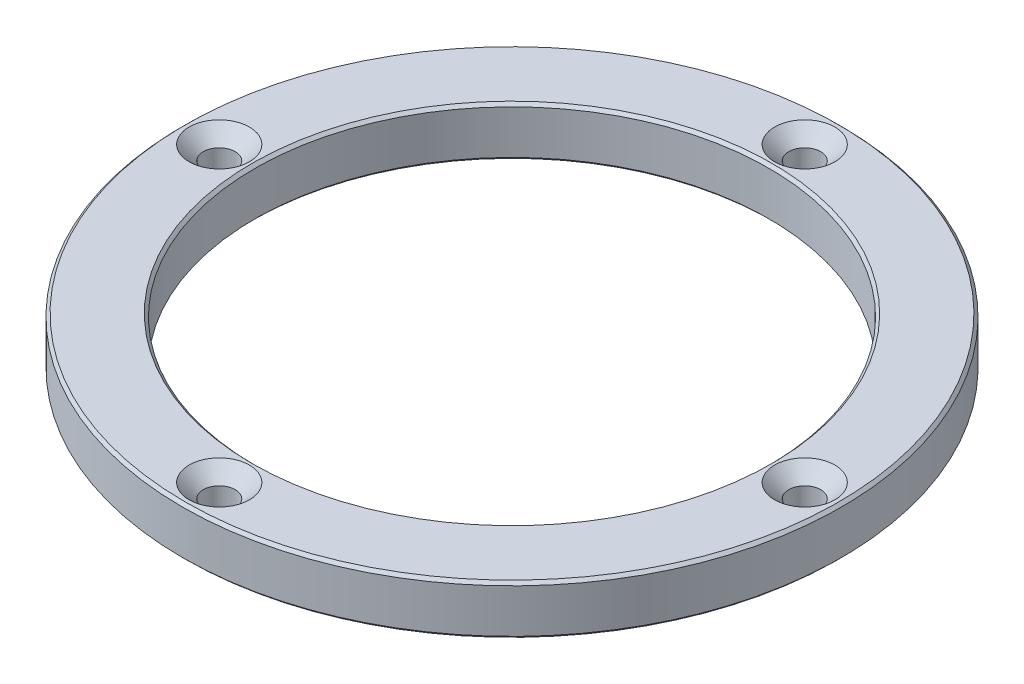
ISO-10303-21;
HEADER;
FILE_DESCRIPTION(('STEP AP214'),'2;1');
FILE_NAME('part.step','',(''),(''),'','','');
FILE_SCHEMA(('AUTOMOTIVE_DESIGN { 1 0 10303 214 1 1 1 1 }'));
ENDSEC;
DATA;
#1=APPLICATION_CONTEXT('core data for automotive mechanical design processes');
#2=APPLICATION_PROTOCOL_DEFINITION('international standard','automotive_design',2000,#1);
#3=PRODUCT_CONTEXT('',#1,'mechanical');
#4=PRODUCT('Part','Part','',(#3));
#5=PRODUCT_RELATED_PRODUCT_CATEGORY('part','',(#4));
#6=PRODUCT_DEFINITION_FORMATION('','',#4);
#7=PRODUCT_DEFINITION_CONTEXT('part definition',#1,'design');
#8=PRODUCT_DEFINITION('design','',#6,#7);
#9=PRODUCT_DEFINITION_SHAPE('','',#8);
#10=(LENGTH_UNIT() NAMED_UNIT(*) SI_UNIT(.MILLI.,.METRE.));
#11=(NAMED_UNIT(*) PLANE_ANGLE_UNIT() SI_UNIT($,.RADIAN.));
#12=(NAMED_UNIT(*) SI_UNIT($,.STERADIAN.) SOLID_ANGLE_UNIT());
#13=UNCERTAINTY_MEASURE_WITH_UNIT(LENGTH_MEASURE(1.E-05),#10,'distance_accuracy_value','');
#14=(GEOMETRIC_REPRESENTATION_CONTEXT(3) GLOBAL_UNCERTAINTY_ASSIGNED_CONTEXT((#13)) GLOBAL_UNIT_ASSIGNED_CONTEXT((#10,
#11,#12)) REPRESENTATION_CONTEXT('',''));
#15=CARTESIAN_POINT('',(0.,0.,0.));
#16=DIRECTION('',(0.,0.,1.));
#17=DIRECTION('',(1.,0.,0.));
#18=AXIS2_PLACEMENT_3D('',#15,#16,#17);
#19=CARTESIAN_POINT('',(0.,4.275,0.));
#20=DIRECTION('',(0.,1.,0.));
#21=DIRECTION('',(0.,0.,1.));
#22=AXIS2_PLACEMENT_3D('',#19,#20,#21);
#23=PLANE('',#22);
#24=CARTESIAN_POINT('',(50.5,4.275,-5.28959422834735E-13));
#25=DIRECTION('',(0.,1.,0.));
#26=DIRECTION('',(0.,0.,1.));
#27=AXIS2_PLACEMENT_3D('',#24,#25,#26);
#28=CIRCLE('',#27,5.2);
#29=CARTESIAN_POINT('',(50.5,4.275,5.19999999999947));
#30=VERTEX_POINT('',#29);
#31=EDGE_CURVE('E205',#30,#30,#28,.T.);
#32=ORIENTED_EDGE('',*,*,#31,.F.);
#33=EDGE_LOOP('',(#32));
#34=FACE_BOUND('',#33,.T.);
#35=CARTESIAN_POINT('',(0.,4.275,50.5));
#36=DIRECTION('',(0.,1.,0.));
#37=DIRECTION('',(0.,0.,1.));
#38=AXIS2_PLACEMENT_3D('',#35,#36,#37);
#39=CIRCLE('',#38,5.2);
#40=CARTESIAN_POINT('',(0.,4.275,55.7));
#41=VERTEX_POINT('',#40);
#42=EDGE_CURVE('E77',#41,#41,#39,.T.);
#43=ORIENTED_EDGE('',*,*,#42,.F.);
#44=EDGE_LOOP('',(#43));
#45=FACE_BOUND('',#44,.T.);
#46=CARTESIAN_POINT('',(-50.5,4.275,1.76319807611578E-13));
#47=DIRECTION('',(0.,1.,0.));
#48=DIRECTION('',(0.,0.,1.));
#49=AXIS2_PLACEMENT_3D('',#46,#47,#48);
#50=CIRCLE('',#49,5.2);
#51=CARTESIAN_POINT('',(-50.5,4.275,5.20000000000017));
#52=VERTEX_POINT('',#51);
#53=EDGE_CURVE('E70',#52,#52,#50,.T.);
#54=ORIENTED_EDGE('',*,*,#53,.F.);
#55=EDGE_LOOP('',(#54));
#56=FACE_BOUND('',#55,.T.);
#57=CARTESIAN_POINT('',(0.,4.275,-50.5));
#58=DIRECTION('',(0.,1.,0.));
#59=DIRECTION('',(0.,0.,1.));
#60=AXIS2_PLACEMENT_3D('',#57,#58,#59);
#61=CIRCLE('',#60,5.2);
#62=CARTESIAN_POINT('',(0.,4.275,-45.3));
#63=VERTEX_POINT('',#62);
#64=EDGE_CURVE('E66',#63,#63,#61,.T.);
#65=ORIENTED_EDGE('',*,*,#64,.F.);
#66=EDGE_LOOP('',(#65));
#67=FACE_BOUND('',#66,.T.);
#68=CARTESIAN_POINT('',(0.,4.275,0.));
#69=DIRECTION('',(0.,1.,0.));
#70=DIRECTION('',(0.,0.,1.));
#71=AXIS2_PLACEMENT_3D('',#68,#69,#70);
#72=CIRCLE('',#71,44.85);
#73=CARTESIAN_POINT('',(0.,4.275,44.85));
#74=VERTEX_POINT('',#73);
#75=EDGE_CURVE('E55',#74,#74,#72,.F.);
#76=ORIENTED_EDGE('',*,*,#75,.T.);
#77=EDGE_LOOP('',(#76));
#78=FACE_BOUND('',#77,.T.);
#79=CARTESIAN_POINT('',(0.,4.275,0.));
#80=DIRECTION('',(0.,1.,0.));
#81=DIRECTION('',(0.,0.,1.));
#82=AXIS2_PLACEMENT_3D('',#79,#80,#81);
#83=CIRCLE('',#82,56.35);
#84=CARTESIAN_POINT('',(0.,4.275,56.35));
#85=VERTEX_POINT('',#84);
#86=EDGE_CURVE('E102',#85,#85,#83,.T.);
#87=ORIENTED_EDGE('',*,*,#86,.T.);
#88=EDGE_LOOP('',(#87));
#89=FACE_BOUND('',#88,.T.);
#90=ADVANCED_FACE('F41',(#34,#45,#56,#67,#78,#89),#23,.T.);
#91=CARTESIAN_POINT('',(0.,-4.275,0.));
#92=DIRECTION('',(0.,1.,0.));
#93=DIRECTION('',(0.,0.,1.));
#94=AXIS2_PLACEMENT_3D('',#91,#92,#93);
#95=PLANE('',#94);
#96=CARTESIAN_POINT('',(50.5,-4.275,-5.28959422834735E-13));
#97=DIRECTION('',(0.,1.,0.));
#98=DIRECTION('',(0.,0.,1.));
#99=AXIS2_PLACEMENT_3D('',#96,#97,#98);
#100=CIRCLE('',#99,2.74999999999999);
#101=CARTESIAN_POINT('',(50.5,-4.275,2.74999999999946));
#102=VERTEX_POINT('',#101);
#103=EDGE_CURVE('E46',#102,#102,#100,.T.);
#104=ORIENTED_EDGE('',*,*,#103,.T.);
#105=EDGE_LOOP('',(#104));
#106=FACE_BOUND('',#105,.T.);
#107=CARTESIAN_POINT('',(0.,-4.275,50.5));
#108=DIRECTION('',(0.,1.,0.));
#109=DIRECTION('',(0.,0.,1.));
#110=AXIS2_PLACEMENT_3D('',#107,#108,#109);
#111=CIRCLE('',#110,2.74999999999999);
#112=CARTESIAN_POINT('',(0.,-4.275,53.25));
#113=VERTEX_POINT('',#112);
#114=EDGE_CURVE('E68',#113,#113,#111,.T.);
#115=ORIENTED_EDGE('',*,*,#114,.T.);
#116=EDGE_LOOP('',(#115));
#117=FACE_BOUND('',#116,.T.);
#118=CARTESIAN_POINT('',(-50.5,-4.275,1.76319807611578E-13));
#119=DIRECTION('',(0.,1.,0.));
#120=DIRECTION('',(0.,0.,1.));
#121=AXIS2_PLACEMENT_3D('',#118,#119,#120);
#122=CIRCLE('',#121,2.74999999999999);
#123=CARTESIAN_POINT('',(-50.5,-4.275,2.75000000000017));
#124=VERTEX_POINT('',#123);
#125=EDGE_CURVE('E64',#124,#124,#122,.T.);
#126=ORIENTED_EDGE('',*,*,#125,.T.);
#127=EDGE_LOOP('',(#126));
#128=FACE_BOUND('',#127,.T.);
#129=CARTESIAN_POINT('',(0.,-4.275,-50.5));
#130=DIRECTION('',(0.,1.,0.));
#131=DIRECTION('',(0.,0.,1.));
#132=AXIS2_PLACEMENT_3D('',#129,#130,#131);
#133=CIRCLE('',#132,2.74999999999999);
#134=CARTESIAN_POINT('',(0.,-4.275,-47.75));
#135=VERTEX_POINT('',#134);
#136=EDGE_CURVE('E59',#135,#135,#133,.T.);
#137=ORIENTED_EDGE('',*,*,#136,.T.);
#138=EDGE_LOOP('',(#137));
#139=FACE_BOUND('',#138,.T.);
#140=CARTESIAN_POINT('',(0.,-4.275,0.));
#141=DIRECTION('',(0.,1.,0.));
#142=DIRECTION('',(0.,0.,1.));
#143=AXIS2_PLACEMENT_3D('',#140,#141,#142);
#144=CIRCLE('',#143,44.85);
#145=CARTESIAN_POINT('',(0.,-4.275,44.85));
#146=VERTEX_POINT('',#145);
#147=EDGE_CURVE('E93',#146,#146,#144,.T.);
#148=ORIENTED_EDGE('',*,*,#147,.T.);
#149=EDGE_LOOP('',(#148));
#150=FACE_BOUND('',#149,.T.);
#151=CARTESIAN_POINT('',(0.,-4.275,0.));
#152=DIRECTION('',(0.,1.,0.));
#153=DIRECTION('',(0.,0.,1.));
#154=AXIS2_PLACEMENT_3D('',#151,#152,#153);
#155=CIRCLE('',#154,56.35);
#156=CARTESIAN_POINT('',(0.,-4.275,56.35));
#157=VERTEX_POINT('',#156);
#158=EDGE_CURVE('E62',#157,#157,#155,.F.);
#159=ORIENTED_EDGE('',*,*,#158,.T.);
#160=EDGE_LOOP('',(#159));
#161=FACE_BOUND('',#160,.T.);
#162=ADVANCED_FACE('F128',(#106,#117,#128,#139,#150,#161),#95,.F.);
#163=CARTESIAN_POINT('',(0.,4.275,0.));
#164=DIRECTION('',(0.,-1.,0.));
#165=DIRECTION('',(0.,0.,-1.));
#166=AXIS2_PLACEMENT_3D('',#163,#164,#165);
#167=CYLINDRICAL_SURFACE('',#166,56.85);
#168=CARTESIAN_POINT('',(0.,-3.775,0.));
#169=DIRECTION('',(0.,1.,0.));
#170=DIRECTION('',(0.,0.,1.));
#171=AXIS2_PLACEMENT_3D('',#168,#169,#170);
#172=CIRCLE('',#171,56.85);
#173=CARTESIAN_POINT('',(0.,-3.775,56.85));
#174=VERTEX_POINT('',#173);
#175=EDGE_CURVE('E10',#174,#174,#172,.T.);
#176=ORIENTED_EDGE('',*,*,#175,.T.);
#177=EDGE_LOOP('',(#176));
#178=FACE_BOUND('',#177,.T.);
#179=CARTESIAN_POINT('',(0.,3.775,0.));
#180=DIRECTION('',(0.,1.,0.));
#181=DIRECTION('',(0.,0.,1.));
#182=AXIS2_PLACEMENT_3D('',#179,#180,#181);
#183=CIRCLE('',#182,56.85);
#184=CARTESIAN_POINT('',(0.,3.775,56.85));
#185=VERTEX_POINT('',#184);
#186=EDGE_CURVE('E50',#185,#185,#183,.F.);
#187=ORIENTED_EDGE('',*,*,#186,.T.);
#188=EDGE_LOOP('',(#187));
#189=FACE_BOUND('',#188,.T.);
#190=ADVANCED_FACE('F119',(#178,#189),#167,.T.);
#191=CARTESIAN_POINT('',(0.,4.275,0.));
#192=DIRECTION('',(0.,-1.,0.));
#193=DIRECTION('',(0.,0.,-1.));
#194=AXIS2_PLACEMENT_3D('',#191,#192,#193);
#195=CYLINDRICAL_SURFACE('',#194,44.35);
#196=CARTESIAN_POINT('',(0.,-3.77499999999999,0.));
#197=DIRECTION('',(0.,1.,0.));
#198=DIRECTION('',(0.,0.,1.));
#199=AXIS2_PLACEMENT_3D('',#196,#197,#198);
#200=CIRCLE('',#199,44.35);
#201=CARTESIAN_POINT('',(0.,-3.77499999999999,44.35));
#202=VERTEX_POINT('',#201);
#203=EDGE_CURVE('E99',#202,#202,#200,.F.);
#204=ORIENTED_EDGE('',*,*,#203,.T.);
#205=EDGE_LOOP('',(#204));
#206=FACE_BOUND('',#205,.T.);
#207=CARTESIAN_POINT('',(0.,3.77499999999999,0.));
#208=DIRECTION('',(0.,1.,0.));
#209=DIRECTION('',(0.,0.,1.));
#210=AXIS2_PLACEMENT_3D('',#207,#208,#209);
#211=CIRCLE('',#210,44.35);
#212=CARTESIAN_POINT('',(0.,3.77499999999999,44.35));
#213=VERTEX_POINT('',#212);
#214=EDGE_CURVE('E96',#213,#213,#211,.T.);
#215=ORIENTED_EDGE('',*,*,#214,.T.);
#216=EDGE_LOOP('',(#215));
#217=FACE_BOUND('',#216,.T.);
#218=ADVANCED_FACE('F117',(#206,#217),#195,.F.);
#219=CARTESIAN_POINT('',(0.,-4.275,0.));
#220=DIRECTION('',(0.,-1.,0.));
#221=DIRECTION('',(0.,0.,-1.));
#222=AXIS2_PLACEMENT_3D('',#219,#220,#221);
#223=CONICAL_SURFACE('',#222,44.85,0.785398163397448);
#224=ORIENTED_EDGE('',*,*,#203,.F.);
#225=EDGE_LOOP('',(#224));
#226=FACE_BOUND('',#225,.T.);
#227=ORIENTED_EDGE('',*,*,#147,.F.);
#228=EDGE_LOOP('',(#227));
#229=FACE_BOUND('',#228,.T.);
#230=ADVANCED_FACE('F113',(#226,#229),#223,.F.);
#231=CARTESIAN_POINT('',(0.,3.77499999999999,0.));
#232=DIRECTION('',(0.,1.,0.));
#233=DIRECTION('',(0.,0.,1.));
#234=AXIS2_PLACEMENT_3D('',#231,#232,#233);
#235=CONICAL_SURFACE('',#234,44.35,0.785398163397462);
#236=ORIENTED_EDGE('',*,*,#75,.F.);
#237=EDGE_LOOP('',(#236));
#238=FACE_BOUND('',#237,.T.);
#239=ORIENTED_EDGE('',*,*,#214,.F.);
#240=EDGE_LOOP('',(#239));
#241=FACE_BOUND('',#240,.T.);
#242=ADVANCED_FACE('F109',(#238,#241),#235,.F.);
#243=CARTESIAN_POINT('',(0.,-3.775,0.));
#244=DIRECTION('',(0.,1.,0.));
#245=DIRECTION('',(0.,0.,1.));
#246=AXIS2_PLACEMENT_3D('',#243,#244,#245);
#247=CONICAL_SURFACE('',#246,56.85,0.785398163397462);
#248=ORIENTED_EDGE('',*,*,#158,.F.);
#249=EDGE_LOOP('',(#248));
#250=FACE_BOUND('',#249,.T.);
#251=ORIENTED_EDGE('',*,*,#175,.F.);
#252=EDGE_LOOP('',(#251));
#253=FACE_BOUND('',#252,.T.);
#254=ADVANCED_FACE('F112',(#250,#253),#247,.T.);
#255=CARTESIAN_POINT('',(0.,4.275,0.));
#256=DIRECTION('',(0.,-1.,0.));
#257=DIRECTION('',(0.,0.,-1.));
#258=AXIS2_PLACEMENT_3D('',#255,#256,#257);
#259=CONICAL_SURFACE('',#258,56.35,0.785398163397455);
#260=ORIENTED_EDGE('',*,*,#186,.F.);
#261=EDGE_LOOP('',(#260));
#262=FACE_BOUND('',#261,.T.);
#263=ORIENTED_EDGE('',*,*,#86,.F.);
#264=EDGE_LOOP('',(#263));
#265=FACE_BOUND('',#264,.T.);
#266=ADVANCED_FACE('F44',(#262,#265),#259,.T.);
#267=CARTESIAN_POINT('',(0.,4.275,-50.5));
#268=DIRECTION('',(0.,1.,0.));
#269=DIRECTION('',(0.,0.,1.));
#270=AXIS2_PLACEMENT_3D('',#267,#268,#269);
#271=CYLINDRICAL_SURFACE('',#270,2.74999999999999);
#272=CARTESIAN_POINT('',(0.,1.82499999999999,-50.5));
#273=DIRECTION('',(0.,1.,0.));
#274=DIRECTION('',(0.,0.,1.));
#275=AXIS2_PLACEMENT_3D('',#272,#273,#274);
#276=CIRCLE('',#275,2.74999999999999);
#277=CARTESIAN_POINT('',(0.,1.82499999999999,-47.75));
#278=VERTEX_POINT('',#277);
#279=EDGE_CURVE('E63',#278,#278,#276,.T.);
#280=ORIENTED_EDGE('',*,*,#279,.T.);
#281=EDGE_LOOP('',(#280));
#282=FACE_BOUND('',#281,.T.);
#283=ORIENTED_EDGE('',*,*,#136,.F.);
#284=EDGE_LOOP('',(#283));
#285=FACE_BOUND('',#284,.T.);
#286=ADVANCED_FACE('F156',(#282,#285),#271,.F.);
#287=CARTESIAN_POINT('',(0.,4.275,-50.5));
#288=DIRECTION('',(0.,1.,0.));
#289=DIRECTION('',(0.,0.,1.));
#290=AXIS2_PLACEMENT_3D('',#287,#288,#289);
#291=CONICAL_SURFACE('',#290,5.2,0.785398163397448);
#292=ORIENTED_EDGE('',*,*,#279,.F.);
#293=EDGE_LOOP('',(#292));
#294=FACE_BOUND('',#293,.T.);
#295=ORIENTED_EDGE('',*,*,#64,.T.);
#296=EDGE_LOOP('',(#295));
#297=FACE_BOUND('',#296,.T.);
#298=ADVANCED_FACE('F164',(#294,#297),#291,.F.);
#299=CARTESIAN_POINT('',(-50.5,4.275,1.76319807611578E-13));
#300=DIRECTION('',(0.,1.,0.));
#301=DIRECTION('',(0.,0.,1.));
#302=AXIS2_PLACEMENT_3D('',#299,#300,#301);
#303=CYLINDRICAL_SURFACE('',#302,2.74999999999999);
#304=CARTESIAN_POINT('',(-50.5,1.82499999999999,1.76319807611578E-13));
#305=DIRECTION('',(0.,1.,0.));
#306=DIRECTION('',(0.,0.,1.));
#307=AXIS2_PLACEMENT_3D('',#304,#305,#306);
#308=CIRCLE('',#307,2.74999999999999);
#309=CARTESIAN_POINT('',(-50.5,1.82499999999999,2.75000000000017));
#310=VERTEX_POINT('',#309);
#311=EDGE_CURVE('E67',#310,#310,#308,.T.);
#312=ORIENTED_EDGE('',*,*,#311,.T.);
#313=EDGE_LOOP('',(#312));
#314=FACE_BOUND('',#313,.T.);
#315=ORIENTED_EDGE('',*,*,#125,.F.);
#316=EDGE_LOOP('',(#315));
#317=FACE_BOUND('',#316,.T.);
#318=ADVANCED_FACE('F172',(#314,#317),#303,.F.);
#319=CARTESIAN_POINT('',(-50.5,4.275,1.76319807611578E-13));
#320=DIRECTION('',(0.,1.,0.));
#321=DIRECTION('',(0.,0.,1.));
#322=AXIS2_PLACEMENT_3D('',#319,#320,#321);
#323=CONICAL_SURFACE('',#322,5.2,0.785398163397448);
#324=ORIENTED_EDGE('',*,*,#311,.F.);
#325=EDGE_LOOP('',(#324));
#326=FACE_BOUND('',#325,.T.);
#327=ORIENTED_EDGE('',*,*,#53,.T.);
#328=EDGE_LOOP('',(#327));
#329=FACE_BOUND('',#328,.T.);
#330=ADVANCED_FACE('F179',(#326,#329),#323,.F.);
#331=CARTESIAN_POINT('',(0.,4.275,50.5));
#332=DIRECTION('',(0.,1.,0.));
#333=DIRECTION('',(0.,0.,1.));
#334=AXIS2_PLACEMENT_3D('',#331,#332,#333);
#335=CYLINDRICAL_SURFACE('',#334,2.74999999999999);
#336=CARTESIAN_POINT('',(0.,1.82499999999999,50.5));
#337=DIRECTION('',(0.,1.,0.));
#338=DIRECTION('',(0.,0.,1.));
#339=AXIS2_PLACEMENT_3D('',#336,#337,#338);
#340=CIRCLE('',#339,2.74999999999999);
#341=CARTESIAN_POINT('',(0.,1.82499999999999,53.25));
#342=VERTEX_POINT('',#341);
#343=EDGE_CURVE('E71',#342,#342,#340,.T.);
#344=ORIENTED_EDGE('',*,*,#343,.T.);
#345=EDGE_LOOP('',(#344));
#346=FACE_BOUND('',#345,.T.);
#347=ORIENTED_EDGE('',*,*,#114,.F.);
#348=EDGE_LOOP('',(#347));
#349=FACE_BOUND('',#348,.T.);
#350=ADVANCED_FACE('F183',(#346,#349),#335,.F.);
#351=CARTESIAN_POINT('',(0.,4.275,50.5));
#352=DIRECTION('',(0.,1.,0.));
#353=DIRECTION('',(0.,0.,1.));
#354=AXIS2_PLACEMENT_3D('',#351,#352,#353);
#355=CONICAL_SURFACE('',#354,5.2,0.785398163397448);
#356=ORIENTED_EDGE('',*,*,#343,.F.);
#357=EDGE_LOOP('',(#356));
#358=FACE_BOUND('',#357,.T.);
#359=ORIENTED_EDGE('',*,*,#42,.T.);
#360=EDGE_LOOP('',(#359));
#361=FACE_BOUND('',#360,.T.);
#362=ADVANCED_FACE('F187',(#358,#361),#355,.F.);
#363=CARTESIAN_POINT('',(50.5,4.275,-5.28959422834735E-13));
#364=DIRECTION('',(0.,1.,0.));
#365=DIRECTION('',(0.,0.,1.));
#366=AXIS2_PLACEMENT_3D('',#363,#364,#365);
#367=CYLINDRICAL_SURFACE('',#366,2.74999999999999);
#368=CARTESIAN_POINT('',(50.5,1.82499999999999,-5.28959422834735E-13));
#369=DIRECTION('',(0.,1.,0.));
#370=DIRECTION('',(0.,0.,1.));
#371=AXIS2_PLACEMENT_3D('',#368,#369,#370);
#372=CIRCLE('',#371,2.74999999999999);
#373=CARTESIAN_POINT('',(50.5,1.82499999999999,2.74999999999946));
#374=VERTEX_POINT('',#373);
#375=EDGE_CURVE('E203',#374,#374,#372,.T.);
#376=ORIENTED_EDGE('',*,*,#375,.T.);
#377=EDGE_LOOP('',(#376));
#378=FACE_BOUND('',#377,.T.);
#379=ORIENTED_EDGE('',*,*,#103,.F.);
#380=EDGE_LOOP('',(#379));
#381=FACE_BOUND('',#380,.T.);
#382=ADVANCED_FACE('F190',(#378,#381),#367,.F.);
#383=CARTESIAN_POINT('',(50.5,4.275,-5.28959422834735E-13));
#384=DIRECTION('',(0.,1.,0.));
#385=DIRECTION('',(0.,0.,1.));
#386=AXIS2_PLACEMENT_3D('',#383,#384,#385);
#387=CONICAL_SURFACE('',#386,5.2,0.785398163397448);
#388=ORIENTED_EDGE('',*,*,#375,.F.);
#389=EDGE_LOOP('',(#388));
#390=FACE_BOUND('',#389,.T.);
#391=ORIENTED_EDGE('',*,*,#31,.T.);
#392=EDGE_LOOP('',(#391));
#393=FACE_BOUND('',#392,.T.);
#394=ADVANCED_FACE('F194',(#390,#393),#387,.F.);
#395=CLOSED_SHELL('',(#90,#162,#190,#218,#230,#242,#254,#266,#286,#298,#318,#330,#350,#362,#382,#394));
#396=MANIFOLD_SOLID_BREP('B2',#395);
#397=ADVANCED_BREP_SHAPE_REPRESENTATION('',(#18,#396),#14);
#398=SHAPE_DEFINITION_REPRESENTATION(#9,#397);
ENDSEC;
END-ISO-10303-21;
